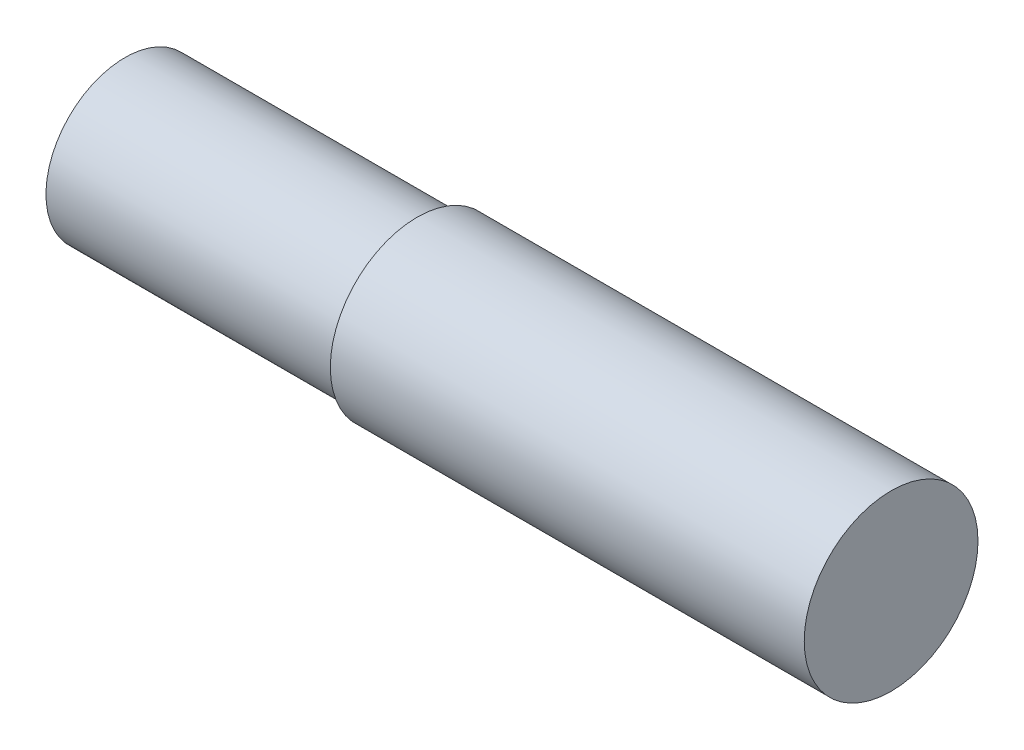
ISO-10303-21;
HEADER;
FILE_DESCRIPTION(('STEP AP214'),'2;1');
FILE_NAME('part.step','',(''),(''),'','','');
FILE_SCHEMA(('AUTOMOTIVE_DESIGN { 1 0 10303 214 1 1 1 1 }'));
ENDSEC;
DATA;
#1=APPLICATION_CONTEXT('core data for automotive mechanical design processes');
#2=APPLICATION_PROTOCOL_DEFINITION('international standard','automotive_design',2000,#1);
#3=PRODUCT_CONTEXT('',#1,'mechanical');
#4=PRODUCT('Part','Part','',(#3));
#5=PRODUCT_RELATED_PRODUCT_CATEGORY('part','',(#4));
#6=PRODUCT_DEFINITION_FORMATION('','',#4);
#7=PRODUCT_DEFINITION_CONTEXT('part definition',#1,'design');
#8=PRODUCT_DEFINITION('design','',#6,#7);
#9=PRODUCT_DEFINITION_SHAPE('','',#8);
#10=(LENGTH_UNIT() NAMED_UNIT(*) SI_UNIT(.MILLI.,.METRE.));
#11=(NAMED_UNIT(*) PLANE_ANGLE_UNIT() SI_UNIT($,.RADIAN.));
#12=(NAMED_UNIT(*) SI_UNIT($,.STERADIAN.) SOLID_ANGLE_UNIT());
#13=UNCERTAINTY_MEASURE_WITH_UNIT(LENGTH_MEASURE(1.E-05),#10,'distance_accuracy_value','');
#14=(GEOMETRIC_REPRESENTATION_CONTEXT(3) GLOBAL_UNCERTAINTY_ASSIGNED_CONTEXT((#13)) GLOBAL_UNIT_ASSIGNED_CONTEXT((#10,
#11,#12)) REPRESENTATION_CONTEXT('',''));
#15=CARTESIAN_POINT('',(0.,0.,0.));
#16=DIRECTION('',(0.,0.,1.));
#17=DIRECTION('',(1.,0.,0.));
#18=AXIS2_PLACEMENT_3D('',#15,#16,#17);
#19=CARTESIAN_POINT('',(-48.5,0.,0.));
#20=DIRECTION('',(1.,0.,0.));
#21=DIRECTION('',(0.,1.,0.));
#22=AXIS2_PLACEMENT_3D('',#19,#20,#21);
#23=PLANE('',#22);
#24=CARTESIAN_POINT('',(-48.5,-5.5,0.));
#25=DIRECTION('',(-1.,0.,0.));
#26=DIRECTION('',(0.,-1.,0.));
#27=AXIS2_PLACEMENT_3D('',#24,#25,#26);
#28=CIRCLE('',#27,3.);
#29=CARTESIAN_POINT('',(-48.5,-8.5,0.));
#30=VERTEX_POINT('',#29);
#31=EDGE_CURVE('E43',#30,#30,#28,.T.);
#32=ORIENTED_EDGE('',*,*,#31,.F.);
#33=EDGE_LOOP('',(#32));
#34=FACE_BOUND('',#33,.T.);
#35=CARTESIAN_POINT('',(-48.5,-5.5,0.));
#36=DIRECTION('',(-1.,0.,0.));
#37=DIRECTION('',(0.,-1.,0.));
#38=AXIS2_PLACEMENT_3D('',#35,#36,#37);
#39=CIRCLE('',#38,5.);
#40=CARTESIAN_POINT('',(-48.5,-10.5,0.));
#41=VERTEX_POINT('',#40);
#42=EDGE_CURVE('E52',#41,#41,#39,.T.);
#43=ORIENTED_EDGE('',*,*,#42,.T.);
#44=EDGE_LOOP('',(#43));
#45=FACE_BOUND('',#44,.T.);
#46=ADVANCED_FACE('F35',(#34,#45),#23,.F.);
#47=CARTESIAN_POINT('',(-35.5,-5.50000000000001,0.));
#48=DIRECTION('',(-1.,0.,0.));
#49=DIRECTION('',(0.,-1.,0.));
#50=AXIS2_PLACEMENT_3D('',#47,#48,#49);
#51=CYLINDRICAL_SURFACE('',#50,3.);
#52=CARTESIAN_POINT('',(-35.5,-5.50000000000001,0.));
#53=DIRECTION('',(-1.,0.,0.));
#54=DIRECTION('',(0.,-1.,0.));
#55=AXIS2_PLACEMENT_3D('',#52,#53,#54);
#56=CIRCLE('',#55,3.);
#57=CARTESIAN_POINT('',(-35.5,-8.50000000000001,0.));
#58=VERTEX_POINT('',#57);
#59=EDGE_CURVE('E47',#58,#58,#56,.T.);
#60=ORIENTED_EDGE('',*,*,#59,.F.);
#61=EDGE_LOOP('',(#60));
#62=FACE_BOUND('',#61,.T.);
#63=ORIENTED_EDGE('',*,*,#31,.T.);
#64=EDGE_LOOP('',(#63));
#65=FACE_BOUND('',#64,.T.);
#66=ADVANCED_FACE('F73',(#62,#65),#51,.F.);
#67=CARTESIAN_POINT('',(-35.5,-2.50000000000001,0.));
#68=DIRECTION('',(1.,0.,0.));
#69=DIRECTION('',(0.,1.,0.));
#70=AXIS2_PLACEMENT_3D('',#67,#68,#69);
#71=PLANE('',#70);
#72=ORIENTED_EDGE('',*,*,#59,.T.);
#73=EDGE_LOOP('',(#72));
#74=FACE_BOUND('',#73,.T.);
#75=ADVANCED_FACE('F78',(#74),#71,.F.);
#76=CARTESIAN_POINT('',(-30.,-5.50000000000001,0.));
#77=DIRECTION('',(-1.,0.,0.));
#78=DIRECTION('',(0.,-1.,0.));
#79=AXIS2_PLACEMENT_3D('',#76,#77,#78);
#80=PLANE('',#79);
#81=CARTESIAN_POINT('',(-30.,-5.50000000000001,0.));
#82=DIRECTION('',(-1.,0.,0.));
#83=DIRECTION('',(0.,-1.,0.));
#84=AXIS2_PLACEMENT_3D('',#81,#82,#83);
#85=CIRCLE('',#84,5.);
#86=CARTESIAN_POINT('',(-30.,-10.5,0.));
#87=VERTEX_POINT('',#86);
#88=EDGE_CURVE('E55',#87,#87,#85,.T.);
#89=ORIENTED_EDGE('',*,*,#88,.F.);
#90=EDGE_LOOP('',(#89));
#91=FACE_BOUND('',#90,.T.);
#92=CARTESIAN_POINT('',(-30.,-5.50000000000001,0.));
#93=DIRECTION('',(-1.,0.,0.));
#94=DIRECTION('',(0.,-1.,0.));
#95=AXIS2_PLACEMENT_3D('',#92,#93,#94);
#96=CIRCLE('',#95,5.5);
#97=CARTESIAN_POINT('',(-30.,-11.,0.));
#98=VERTEX_POINT('',#97);
#99=EDGE_CURVE('E39',#98,#98,#96,.T.);
#100=ORIENTED_EDGE('',*,*,#99,.T.);
#101=EDGE_LOOP('',(#100));
#102=FACE_BOUND('',#101,.T.);
#103=ADVANCED_FACE('F62',(#91,#102),#80,.T.);
#104=CARTESIAN_POINT('',(-30.,-5.50000000000001,0.));
#105=DIRECTION('',(-1.,0.,0.));
#106=DIRECTION('',(0.,-1.,0.));
#107=AXIS2_PLACEMENT_3D('',#104,#105,#106);
#108=CYLINDRICAL_SURFACE('',#107,5.);
#109=ORIENTED_EDGE('',*,*,#88,.T.);
#110=EDGE_LOOP('',(#109));
#111=FACE_BOUND('',#110,.T.);
#112=ORIENTED_EDGE('',*,*,#42,.F.);
#113=EDGE_LOOP('',(#112));
#114=FACE_BOUND('',#113,.T.);
#115=ADVANCED_FACE('F69',(#111,#114),#108,.T.);
#116=CARTESIAN_POINT('',(0.,-5.50000000000001,0.));
#117=DIRECTION('',(-1.,0.,0.));
#118=DIRECTION('',(0.,-1.,0.));
#119=AXIS2_PLACEMENT_3D('',#116,#117,#118);
#120=PLANE('',#119);
#121=CARTESIAN_POINT('',(0.,-5.50000000000001,0.));
#122=DIRECTION('',(-1.,0.,0.));
#123=DIRECTION('',(0.,-1.,0.));
#124=AXIS2_PLACEMENT_3D('',#121,#122,#123);
#125=CIRCLE('',#124,5.50000000000001);
#126=CARTESIAN_POINT('',(0.,-11.,0.));
#127=VERTEX_POINT('',#126);
#128=EDGE_CURVE('E11',#127,#127,#125,.T.);
#129=ORIENTED_EDGE('',*,*,#128,.F.);
#130=EDGE_LOOP('',(#129));
#131=FACE_BOUND('',#130,.T.);
#132=ADVANCED_FACE('F37',(#131),#120,.F.);
#133=CARTESIAN_POINT('',(-35.5,-5.50000000000001,0.));
#134=DIRECTION('',(-1.,0.,0.));
#135=DIRECTION('',(0.,-1.,0.));
#136=AXIS2_PLACEMENT_3D('',#133,#134,#135);
#137=CYLINDRICAL_SURFACE('',#136,5.5);
#138=ORIENTED_EDGE('',*,*,#128,.T.);
#139=EDGE_LOOP('',(#138));
#140=FACE_BOUND('',#139,.T.);
#141=ORIENTED_EDGE('',*,*,#99,.F.);
#142=EDGE_LOOP('',(#141));
#143=FACE_BOUND('',#142,.T.);
#144=ADVANCED_FACE('F64',(#140,#143),#137,.T.);
#145=CLOSED_SHELL('',(#46,#66,#75,#103,#115,#132,#144));
#146=MANIFOLD_SOLID_BREP('B2',#145);
#147=ADVANCED_BREP_SHAPE_REPRESENTATION('',(#18,#146),#14);
#148=SHAPE_DEFINITION_REPRESENTATION(#9,#147);
ENDSEC;
END-ISO-10303-21;
